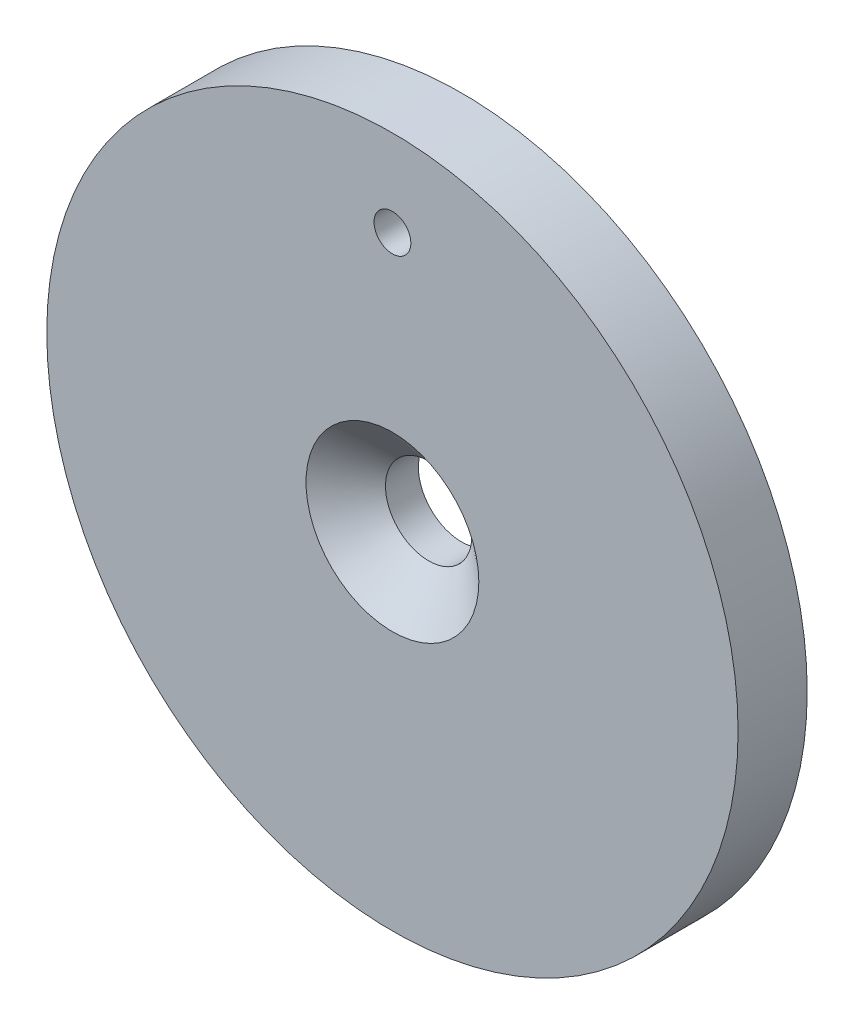
ISO-10303-21;
HEADER;
FILE_DESCRIPTION(('STEP AP214'),'2;1');
FILE_NAME('part.step','',(''),(''),'','','');
FILE_SCHEMA(('AUTOMOTIVE_DESIGN { 1 0 10303 214 1 1 1 1 }'));
ENDSEC;
DATA;
#1=APPLICATION_CONTEXT('core data for automotive mechanical design processes');
#2=APPLICATION_PROTOCOL_DEFINITION('international standard','automotive_design',2000,#1);
#3=PRODUCT_CONTEXT('',#1,'mechanical');
#4=PRODUCT('Part','Part','',(#3));
#5=PRODUCT_RELATED_PRODUCT_CATEGORY('part','',(#4));
#6=PRODUCT_DEFINITION_FORMATION('','',#4);
#7=PRODUCT_DEFINITION_CONTEXT('part definition',#1,'design');
#8=PRODUCT_DEFINITION('design','',#6,#7);
#9=PRODUCT_DEFINITION_SHAPE('','',#8);
#10=(LENGTH_UNIT() NAMED_UNIT(*) SI_UNIT(.MILLI.,.METRE.));
#11=(NAMED_UNIT(*) PLANE_ANGLE_UNIT() SI_UNIT($,.RADIAN.));
#12=(NAMED_UNIT(*) SI_UNIT($,.STERADIAN.) SOLID_ANGLE_UNIT());
#13=UNCERTAINTY_MEASURE_WITH_UNIT(LENGTH_MEASURE(1.E-05),#10,'distance_accuracy_value','');
#14=(GEOMETRIC_REPRESENTATION_CONTEXT(3) GLOBAL_UNCERTAINTY_ASSIGNED_CONTEXT((#13)) GLOBAL_UNIT_ASSIGNED_CONTEXT((#10,
#11,#12)) REPRESENTATION_CONTEXT('',''));
#15=CARTESIAN_POINT('',(0.,0.,0.));
#16=DIRECTION('',(0.,0.,1.));
#17=DIRECTION('',(1.,0.,0.));
#18=AXIS2_PLACEMENT_3D('',#15,#16,#17);
#19=CARTESIAN_POINT('',(0.,0.,5.08));
#20=DIRECTION('',(0.,0.,-1.));
#21=DIRECTION('',(-1.,0.,0.));
#22=AXIS2_PLACEMENT_3D('',#19,#20,#21);
#23=CYLINDRICAL_SURFACE('',#22,25.4);
#24=CARTESIAN_POINT('',(0.,0.,5.08));
#25=DIRECTION('',(0.,0.,1.));
#26=DIRECTION('',(1.,0.,0.));
#27=AXIS2_PLACEMENT_3D('',#24,#25,#26);
#28=CIRCLE('',#27,25.4);
#29=CARTESIAN_POINT('',(25.4,0.,5.08));
#30=VERTEX_POINT('',#29);
#31=EDGE_CURVE('E10',#30,#30,#28,.T.);
#32=ORIENTED_EDGE('',*,*,#31,.F.);
#33=EDGE_LOOP('',(#32));
#34=FACE_BOUND('',#33,.T.);
#35=CARTESIAN_POINT('',(0.,0.,0.));
#36=DIRECTION('',(0.,0.,1.));
#37=DIRECTION('',(1.,0.,0.));
#38=AXIS2_PLACEMENT_3D('',#35,#36,#37);
#39=CIRCLE('',#38,25.4);
#40=CARTESIAN_POINT('',(25.4,0.,0.));
#41=VERTEX_POINT('',#40);
#42=EDGE_CURVE('E43',#41,#41,#39,.T.);
#43=ORIENTED_EDGE('',*,*,#42,.T.);
#44=EDGE_LOOP('',(#43));
#45=FACE_BOUND('',#44,.T.);
#46=ADVANCED_FACE('F40',(#34,#45),#23,.T.);
#47=CARTESIAN_POINT('',(0.,0.,5.08));
#48=DIRECTION('',(0.,0.,1.));
#49=DIRECTION('',(1.,0.,0.));
#50=AXIS2_PLACEMENT_3D('',#47,#48,#49);
#51=PLANE('',#50);
#52=CARTESIAN_POINT('',(0.,19.05,5.08));
#53=DIRECTION('',(0.,0.,1.));
#54=DIRECTION('',(1.,0.,0.));
#55=AXIS2_PLACEMENT_3D('',#52,#53,#54);
#56=CIRCLE('',#55,1.35254999999999);
#57=CARTESIAN_POINT('',(1.35254999999999,19.05,5.08));
#58=VERTEX_POINT('',#57);
#59=EDGE_CURVE('E70',#58,#58,#56,.T.);
#60=ORIENTED_EDGE('',*,*,#59,.F.);
#61=EDGE_LOOP('',(#60));
#62=FACE_BOUND('',#61,.T.);
#63=CARTESIAN_POINT('',(0.,0.,5.08));
#64=DIRECTION('',(0.,0.,1.));
#65=DIRECTION('',(1.,0.,0.));
#66=AXIS2_PLACEMENT_3D('',#63,#64,#65);
#67=CIRCLE('',#66,6.35);
#68=CARTESIAN_POINT('',(6.35,0.,5.08));
#69=VERTEX_POINT('',#68);
#70=EDGE_CURVE('E53',#69,#69,#67,.T.);
#71=ORIENTED_EDGE('',*,*,#70,.F.);
#72=EDGE_LOOP('',(#71));
#73=FACE_BOUND('',#72,.T.);
#74=ORIENTED_EDGE('',*,*,#31,.T.);
#75=EDGE_LOOP('',(#74));
#76=FACE_BOUND('',#75,.T.);
#77=ADVANCED_FACE('F78',(#62,#73,#76),#51,.T.);
#78=CARTESIAN_POINT('',(0.,0.,0.));
#79=DIRECTION('',(0.,0.,1.));
#80=DIRECTION('',(1.,0.,0.));
#81=AXIS2_PLACEMENT_3D('',#78,#79,#80);
#82=PLANE('',#81);
#83=CARTESIAN_POINT('',(0.,19.05,0.));
#84=DIRECTION('',(0.,0.,1.));
#85=DIRECTION('',(1.,0.,0.));
#86=AXIS2_PLACEMENT_3D('',#83,#84,#85);
#87=CIRCLE('',#86,1.35255);
#88=CARTESIAN_POINT('',(1.35255,19.05,0.));
#89=VERTEX_POINT('',#88);
#90=EDGE_CURVE('E66',#89,#89,#87,.T.);
#91=ORIENTED_EDGE('',*,*,#90,.T.);
#92=EDGE_LOOP('',(#91));
#93=FACE_BOUND('',#92,.T.);
#94=CARTESIAN_POINT('',(0.,0.,0.));
#95=DIRECTION('',(0.,0.,1.));
#96=DIRECTION('',(1.,0.,0.));
#97=AXIS2_PLACEMENT_3D('',#94,#95,#96);
#98=CIRCLE('',#97,3.175);
#99=CARTESIAN_POINT('',(3.175,0.,0.));
#100=VERTEX_POINT('',#99);
#101=EDGE_CURVE('E62',#100,#100,#98,.T.);
#102=ORIENTED_EDGE('',*,*,#101,.T.);
#103=EDGE_LOOP('',(#102));
#104=FACE_BOUND('',#103,.T.);
#105=ORIENTED_EDGE('',*,*,#42,.F.);
#106=EDGE_LOOP('',(#105));
#107=FACE_BOUND('',#106,.T.);
#108=ADVANCED_FACE('F81',(#93,#104,#107),#82,.F.);
#109=CARTESIAN_POINT('',(0.,0.,5.08));
#110=DIRECTION('',(0.,0.,1.));
#111=DIRECTION('',(1.,0.,0.));
#112=AXIS2_PLACEMENT_3D('',#109,#110,#111);
#113=CONICAL_SURFACE('',#112,6.35,0.872664625997164);
#114=CARTESIAN_POINT('',(0.,0.,2.41585867101213));
#115=DIRECTION('',(0.,0.,1.));
#116=DIRECTION('',(1.,0.,0.));
#117=AXIS2_PLACEMENT_3D('',#114,#115,#116);
#118=CIRCLE('',#117,3.175);
#119=CARTESIAN_POINT('',(3.175,0.,2.41585867101213));
#120=VERTEX_POINT('',#119);
#121=EDGE_CURVE('E58',#120,#120,#118,.F.);
#122=ORIENTED_EDGE('',*,*,#121,.T.);
#123=EDGE_LOOP('',(#122));
#124=FACE_BOUND('',#123,.T.);
#125=ORIENTED_EDGE('',*,*,#70,.T.);
#126=EDGE_LOOP('',(#125));
#127=FACE_BOUND('',#126,.T.);
#128=ADVANCED_FACE('F85',(#124,#127),#113,.F.);
#129=CARTESIAN_POINT('',(0.,0.,0.));
#130=DIRECTION('',(0.,0.,1.));
#131=DIRECTION('',(1.,0.,0.));
#132=AXIS2_PLACEMENT_3D('',#129,#130,#131);
#133=CYLINDRICAL_SURFACE('',#132,3.175);
#134=ORIENTED_EDGE('',*,*,#101,.F.);
#135=EDGE_LOOP('',(#134));
#136=FACE_BOUND('',#135,.T.);
#137=ORIENTED_EDGE('',*,*,#121,.F.);
#138=EDGE_LOOP('',(#137));
#139=FACE_BOUND('',#138,.T.);
#140=ADVANCED_FACE('F87',(#136,#139),#133,.F.);
#141=CARTESIAN_POINT('',(0.,19.05,5.08));
#142=DIRECTION('',(0.,0.,1.));
#143=DIRECTION('',(1.,0.,0.));
#144=AXIS2_PLACEMENT_3D('',#141,#142,#143);
#145=CYLINDRICAL_SURFACE('',#144,1.35254999999999);
#146=ORIENTED_EDGE('',*,*,#90,.F.);
#147=EDGE_LOOP('',(#146));
#148=FACE_BOUND('',#147,.T.);
#149=ORIENTED_EDGE('',*,*,#59,.T.);
#150=EDGE_LOOP('',(#149));
#151=FACE_BOUND('',#150,.T.);
#152=ADVANCED_FACE('F76',(#148,#151),#145,.F.);
#153=CLOSED_SHELL('',(#46,#77,#108,#128,#140,#152));
#154=MANIFOLD_SOLID_BREP('B2',#153);
#155=ADVANCED_BREP_SHAPE_REPRESENTATION('',(#18,#154),#14);
#156=SHAPE_DEFINITION_REPRESENTATION(#9,#155);
ENDSEC;
END-ISO-10303-21;
